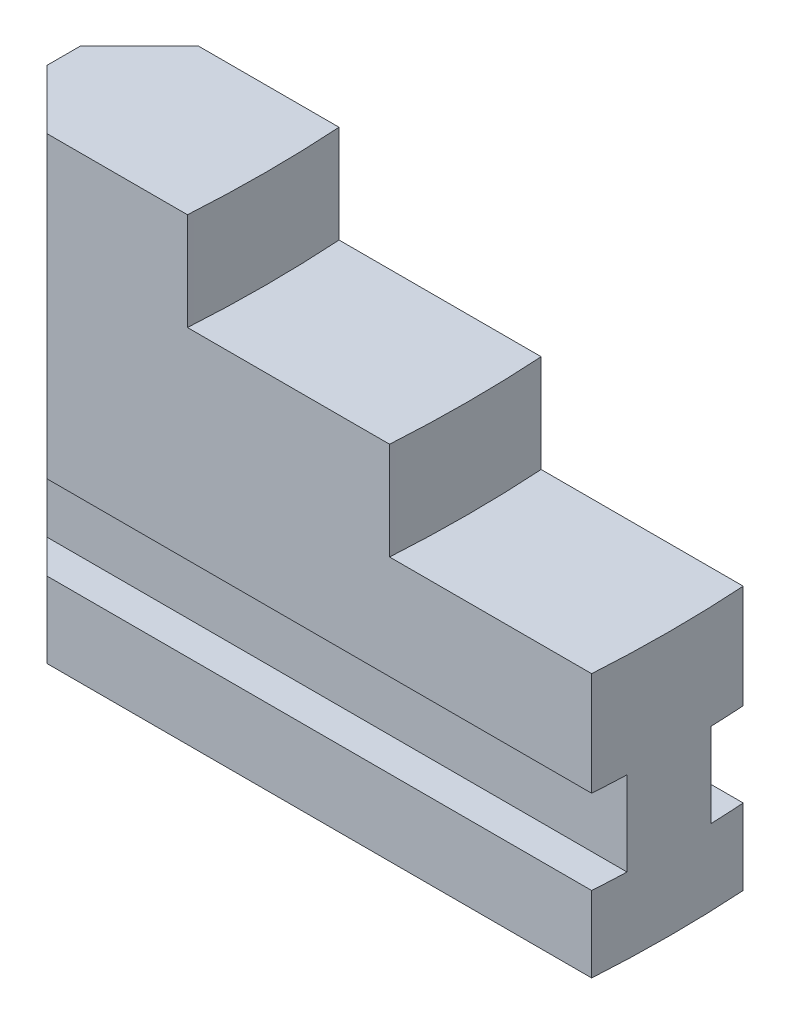
ISO-10303-21;
HEADER;
FILE_DESCRIPTION(('STEP AP214'),'2;1');
FILE_NAME('part.step','',(''),(''),'','','');
FILE_SCHEMA(('AUTOMOTIVE_DESIGN { 1 0 10303 214 1 1 1 1 }'));
ENDSEC;
DATA;
#1=APPLICATION_CONTEXT('core data for automotive mechanical design processes');
#2=APPLICATION_PROTOCOL_DEFINITION('international standard','automotive_design',2000,#1);
#3=PRODUCT_CONTEXT('',#1,'mechanical');
#4=PRODUCT('Part','Part','',(#3));
#5=PRODUCT_RELATED_PRODUCT_CATEGORY('part','',(#4));
#6=PRODUCT_DEFINITION_FORMATION('','',#4);
#7=PRODUCT_DEFINITION_CONTEXT('part definition',#1,'design');
#8=PRODUCT_DEFINITION('design','',#6,#7);
#9=PRODUCT_DEFINITION_SHAPE('','',#8);
#10=(LENGTH_UNIT() NAMED_UNIT(*) SI_UNIT(.MILLI.,.METRE.));
#11=(NAMED_UNIT(*) PLANE_ANGLE_UNIT() SI_UNIT($,.RADIAN.));
#12=(NAMED_UNIT(*) SI_UNIT($,.STERADIAN.) SOLID_ANGLE_UNIT());
#13=UNCERTAINTY_MEASURE_WITH_UNIT(LENGTH_MEASURE(1.E-05),#10,'distance_accuracy_value','');
#14=(GEOMETRIC_REPRESENTATION_CONTEXT(3) GLOBAL_UNCERTAINTY_ASSIGNED_CONTEXT((#13)) GLOBAL_UNIT_ASSIGNED_CONTEXT((#10,
#11,#12)) REPRESENTATION_CONTEXT('',''));
#15=CARTESIAN_POINT('',(0.,0.,0.));
#16=DIRECTION('',(0.,0.,1.));
#17=DIRECTION('',(1.,0.,0.));
#18=AXIS2_PLACEMENT_3D('',#15,#16,#17);
#19=CARTESIAN_POINT('',(0.,54.5,9.));
#20=DIRECTION('',(0.,-1.,0.));
#21=DIRECTION('',(0.,0.,-1.));
#22=AXIS2_PLACEMENT_3D('',#19,#20,#21);
#23=PLANE('',#22);
#24=DIRECTION('',(-1.,0.,0.));
#25=VECTOR('',#24,1.);
#26=CARTESIAN_POINT('',(0.,54.5,-9.));
#27=LINE('',#26,#25);
#28=CARTESIAN_POINT('',(23.7104147871589,54.5,-9.));
#29=VERTEX_POINT('',#28);
#30=CARTESIAN_POINT('',(7.00000000000002,54.5,-9.));
#31=VERTEX_POINT('',#30);
#32=EDGE_CURVE('E199',#29,#31,#27,.T.);
#33=ORIENTED_EDGE('',*,*,#32,.T.);
#34=DIRECTION('',(-0.707106781186549,0.,0.707106781186546));
#35=VECTOR('',#34,1.);
#36=CARTESIAN_POINT('',(0.,54.5,-2.00000000000001));
#37=LINE('',#36,#35);
#38=CARTESIAN_POINT('',(0.,54.5,-2.00000000000001));
#39=VERTEX_POINT('',#38);
#40=EDGE_CURVE('E247',#31,#39,#37,.T.);
#41=ORIENTED_EDGE('',*,*,#40,.T.);
#42=DIRECTION('',(0.,0.,-1.));
#43=VECTOR('',#42,1.);
#44=CARTESIAN_POINT('',(0.,54.5,9.));
#45=LINE('',#44,#43);
#46=CARTESIAN_POINT('',(0.,54.5,1.99999999999998));
#47=VERTEX_POINT('',#46);
#48=EDGE_CURVE('E216',#47,#39,#45,.T.);
#49=ORIENTED_EDGE('',*,*,#48,.F.);
#50=DIRECTION('',(-0.707106781186546,0.,-0.707106781186549));
#51=VECTOR('',#50,1.);
#52=CARTESIAN_POINT('',(6.99999999999999,54.5,9.));
#53=LINE('',#52,#51);
#54=CARTESIAN_POINT('',(6.99999999999999,54.5,9.));
#55=VERTEX_POINT('',#54);
#56=EDGE_CURVE('E245',#47,#55,#53,.F.);
#57=ORIENTED_EDGE('',*,*,#56,.T.);
#58=DIRECTION('',(-1.,0.,0.));
#59=VECTOR('',#58,1.);
#60=CARTESIAN_POINT('',(0.,54.5,9.));
#61=LINE('',#60,#59);
#62=CARTESIAN_POINT('',(23.7104147871589,54.5,9.00000000000004));
#63=VERTEX_POINT('',#62);
#64=EDGE_CURVE('E197',#63,#55,#61,.T.);
#65=ORIENTED_EDGE('',*,*,#64,.F.);
#66=CARTESIAN_POINT('',(-116.,54.5,0.));
#67=DIRECTION('',(0.,-1.,0.));
#68=DIRECTION('',(0.,0.,-1.));
#69=AXIS2_PLACEMENT_3D('',#66,#67,#68);
#70=CIRCLE('',#69,140.);
#71=EDGE_CURVE('E219',#63,#29,#70,.F.);
#72=ORIENTED_EDGE('',*,*,#71,.T.);
#73=EDGE_LOOP('',(#33,#41,#49,#57,#65,#72));
#74=FACE_BOUND('',#73,.T.);
#75=ADVANCED_FACE('F41',(#74),#23,.F.);
#76=CARTESIAN_POINT('',(0.,0.,9.));
#77=DIRECTION('',(0.,0.,-1.));
#78=DIRECTION('',(-1.,0.,0.));
#79=AXIS2_PLACEMENT_3D('',#76,#77,#78);
#80=PLANE('',#79);
#81=ORIENTED_EDGE('',*,*,#64,.T.);
#82=DIRECTION('',(0.,-1.,0.));
#83=VECTOR('',#82,1.);
#84=CARTESIAN_POINT('',(6.99999999999999,0.,9.));
#85=LINE('',#84,#83);
#86=CARTESIAN_POINT('',(6.99999999999999,19.,9.));
#87=VERTEX_POINT('',#86);
#88=EDGE_CURVE('E249',#55,#87,#85,.T.);
#89=ORIENTED_EDGE('',*,*,#88,.T.);
#90=DIRECTION('',(-1.,0.,0.));
#91=VECTOR('',#90,1.);
#92=CARTESIAN_POINT('',(72.,19.,9.));
#93=LINE('',#92,#91);
#94=CARTESIAN_POINT('',(71.7104147871589,19.,9.));
#95=VERTEX_POINT('',#94);
#96=EDGE_CURVE('E187',#95,#87,#93,.T.);
#97=ORIENTED_EDGE('',*,*,#96,.F.);
#98=DIRECTION('',(0.,1.,0.));
#99=VECTOR('',#98,1.);
#100=CARTESIAN_POINT('',(71.7104147871589,-18.1107702762748,9.));
#101=LINE('',#100,#99);
#102=CARTESIAN_POINT('',(71.7104147871589,31.3,9.));
#103=VERTEX_POINT('',#102);
#104=EDGE_CURVE('E170',#95,#103,#101,.T.);
#105=ORIENTED_EDGE('',*,*,#104,.T.);
#106=DIRECTION('',(-1.,0.,0.));
#107=VECTOR('',#106,1.);
#108=CARTESIAN_POINT('',(48.,31.3,9.));
#109=LINE('',#108,#107);
#110=CARTESIAN_POINT('',(47.7104147871589,31.3,9.00000000000001));
#111=VERTEX_POINT('',#110);
#112=EDGE_CURVE('E183',#103,#111,#109,.T.);
#113=ORIENTED_EDGE('',*,*,#112,.T.);
#114=DIRECTION('',(0.,1.,0.));
#115=VECTOR('',#114,1.);
#116=CARTESIAN_POINT('',(47.7104147871589,13.1892297237252,9.00000000000001));
#117=LINE('',#116,#115);
#118=CARTESIAN_POINT('',(47.7104147871589,42.9,9.00000000000001));
#119=VERTEX_POINT('',#118);
#120=EDGE_CURVE('E299',#111,#119,#117,.T.);
#121=ORIENTED_EDGE('',*,*,#120,.T.);
#122=DIRECTION('',(-1.,0.,0.));
#123=VECTOR('',#122,1.);
#124=CARTESIAN_POINT('',(24.,42.9,9.));
#125=LINE('',#124,#123);
#126=CARTESIAN_POINT('',(23.7104147871589,42.9,9.00000000000004));
#127=VERTEX_POINT('',#126);
#128=EDGE_CURVE('E194',#119,#127,#125,.T.);
#129=ORIENTED_EDGE('',*,*,#128,.T.);
#130=DIRECTION('',(0.,1.,0.));
#131=VECTOR('',#130,1.);
#132=CARTESIAN_POINT('',(23.7104147871589,24.789229723725,9.00000000000004));
#133=LINE('',#132,#131);
#134=EDGE_CURVE('E261',#127,#63,#133,.T.);
#135=ORIENTED_EDGE('',*,*,#134,.T.);
#136=EDGE_LOOP('',(#81,#89,#97,#105,#113,#121,#129,#135));
#137=FACE_BOUND('',#136,.T.);
#138=ADVANCED_FACE('F181',(#137),#80,.F.);
#139=CARTESIAN_POINT('',(0.,0.,-9.));
#140=DIRECTION('',(0.,0.,-1.));
#141=DIRECTION('',(-1.,0.,0.));
#142=AXIS2_PLACEMENT_3D('',#139,#140,#141);
#143=PLANE('',#142);
#144=DIRECTION('',(-1.,0.,0.));
#145=VECTOR('',#144,1.);
#146=CARTESIAN_POINT('',(72.,19.,-9.));
#147=LINE('',#146,#145);
#148=CARTESIAN_POINT('',(71.7104147871589,19.,-9.));
#149=VERTEX_POINT('',#148);
#150=CARTESIAN_POINT('',(7.00000000000002,19.,-9.));
#151=VERTEX_POINT('',#150);
#152=EDGE_CURVE('E208',#149,#151,#147,.T.);
#153=ORIENTED_EDGE('',*,*,#152,.T.);
#154=DIRECTION('',(0.,1.,0.));
#155=VECTOR('',#154,1.);
#156=CARTESIAN_POINT('',(7.00000000000002,54.5,-9.));
#157=LINE('',#156,#155);
#158=EDGE_CURVE('E243',#151,#31,#157,.T.);
#159=ORIENTED_EDGE('',*,*,#158,.T.);
#160=ORIENTED_EDGE('',*,*,#32,.F.);
#161=DIRECTION('',(0.,1.,0.));
#162=VECTOR('',#161,1.);
#163=CARTESIAN_POINT('',(23.7104147871589,24.789229723725,-9.));
#164=LINE('',#163,#162);
#165=CARTESIAN_POINT('',(23.7104147871589,42.9,-9.));
#166=VERTEX_POINT('',#165);
#167=EDGE_CURVE('E304',#166,#29,#164,.T.);
#168=ORIENTED_EDGE('',*,*,#167,.F.);
#169=DIRECTION('',(-1.,0.,0.));
#170=VECTOR('',#169,1.);
#171=CARTESIAN_POINT('',(24.,42.9,-9.));
#172=LINE('',#171,#170);
#173=CARTESIAN_POINT('',(47.7104147871589,42.9,-9.));
#174=VERTEX_POINT('',#173);
#175=EDGE_CURVE('E210',#174,#166,#172,.T.);
#176=ORIENTED_EDGE('',*,*,#175,.F.);
#177=DIRECTION('',(0.,1.,0.));
#178=VECTOR('',#177,1.);
#179=CARTESIAN_POINT('',(47.7104147871589,13.1892297237252,-8.99999999999999));
#180=LINE('',#179,#178);
#181=CARTESIAN_POINT('',(47.7104147871589,31.3,-8.99999999999999));
#182=VERTEX_POINT('',#181);
#183=EDGE_CURVE('E301',#182,#174,#180,.T.);
#184=ORIENTED_EDGE('',*,*,#183,.F.);
#185=DIRECTION('',(-1.,0.,0.));
#186=VECTOR('',#185,1.);
#187=CARTESIAN_POINT('',(48.,31.3,-9.));
#188=LINE('',#187,#186);
#189=CARTESIAN_POINT('',(71.7104147871589,31.3,-9.));
#190=VERTEX_POINT('',#189);
#191=EDGE_CURVE('E207',#190,#182,#188,.T.);
#192=ORIENTED_EDGE('',*,*,#191,.F.);
#193=DIRECTION('',(0.,1.,0.));
#194=VECTOR('',#193,1.);
#195=CARTESIAN_POINT('',(71.7104147871589,-18.1107702762748,-9.));
#196=LINE('',#195,#194);
#197=EDGE_CURVE('E173',#149,#190,#196,.T.);
#198=ORIENTED_EDGE('',*,*,#197,.F.);
#199=EDGE_LOOP('',(#153,#159,#160,#168,#176,#184,#192,#198));
#200=FACE_BOUND('',#199,.T.);
#201=ADVANCED_FACE('F344',(#200),#143,.T.);
#202=CARTESIAN_POINT('',(72.,0.,9.));
#203=DIRECTION('',(0.,1.,0.));
#204=DIRECTION('',(-1.,0.,0.));
#205=AXIS2_PLACEMENT_3D('',#202,#203,#204);
#206=PLANE('',#205);
#207=DIRECTION('',(0.,0.,-1.));
#208=VECTOR('',#207,1.);
#209=CARTESIAN_POINT('',(0.,0.,9.));
#210=LINE('',#209,#208);
#211=CARTESIAN_POINT('',(0.,0.,1.99999999999998));
#212=VERTEX_POINT('',#211);
#213=CARTESIAN_POINT('',(0.,0.,-2.00000000000001));
#214=VERTEX_POINT('',#213);
#215=EDGE_CURVE('E204',#212,#214,#210,.T.);
#216=ORIENTED_EDGE('',*,*,#215,.T.);
#217=DIRECTION('',(0.707106781186549,0.,-0.707106781186546));
#218=VECTOR('',#217,1.);
#219=CARTESIAN_POINT('',(0.,0.,-2.00000000000001));
#220=LINE('',#219,#218);
#221=CARTESIAN_POINT('',(7.00000000000002,0.,-9.));
#222=VERTEX_POINT('',#221);
#223=EDGE_CURVE('E233',#214,#222,#220,.T.);
#224=ORIENTED_EDGE('',*,*,#223,.T.);
#225=DIRECTION('',(1.,0.,0.));
#226=VECTOR('',#225,1.);
#227=CARTESIAN_POINT('',(72.,0.,-9.));
#228=LINE('',#227,#226);
#229=CARTESIAN_POINT('',(71.7104147871589,0.,-9.));
#230=VERTEX_POINT('',#229);
#231=EDGE_CURVE('E205',#222,#230,#228,.T.);
#232=ORIENTED_EDGE('',*,*,#231,.T.);
#233=CARTESIAN_POINT('',(-68.,0.,0.));
#234=DIRECTION('',(0.,1.,0.));
#235=DIRECTION('',(-1.,0.,0.));
#236=AXIS2_PLACEMENT_3D('',#233,#234,#235);
#237=CIRCLE('',#236,140.);
#238=CARTESIAN_POINT('',(71.7104147871589,0.,9.));
#239=VERTEX_POINT('',#238);
#240=EDGE_CURVE('E277',#239,#230,#237,.T.);
#241=ORIENTED_EDGE('',*,*,#240,.F.);
#242=DIRECTION('',(1.,0.,0.));
#243=VECTOR('',#242,1.);
#244=CARTESIAN_POINT('',(72.,0.,9.));
#245=LINE('',#244,#243);
#246=CARTESIAN_POINT('',(6.99999999999999,0.,9.));
#247=VERTEX_POINT('',#246);
#248=EDGE_CURVE('E195',#247,#239,#245,.T.);
#249=ORIENTED_EDGE('',*,*,#248,.F.);
#250=DIRECTION('',(0.707106781186546,0.,0.707106781186549));
#251=VECTOR('',#250,1.);
#252=CARTESIAN_POINT('',(6.99999999999999,0.,9.));
#253=LINE('',#252,#251);
#254=EDGE_CURVE('E231',#247,#212,#253,.F.);
#255=ORIENTED_EDGE('',*,*,#254,.T.);
#256=EDGE_LOOP('',(#216,#224,#232,#241,#249,#255));
#257=FACE_BOUND('',#256,.T.);
#258=ADVANCED_FACE('F274',(#257),#206,.F.);
#259=CARTESIAN_POINT('',(48.,31.3,9.));
#260=DIRECTION('',(0.,-1.,0.));
#261=DIRECTION('',(0.,0.,-1.));
#262=AXIS2_PLACEMENT_3D('',#259,#260,#261);
#263=PLANE('',#262);
#264=ORIENTED_EDGE('',*,*,#112,.F.);
#265=CARTESIAN_POINT('',(-68.,31.3,0.));
#266=DIRECTION('',(0.,-1.,0.));
#267=DIRECTION('',(0.,0.,-1.));
#268=AXIS2_PLACEMENT_3D('',#265,#266,#267);
#269=CIRCLE('',#268,140.);
#270=EDGE_CURVE('E167',#190,#103,#269,.T.);
#271=ORIENTED_EDGE('',*,*,#270,.F.);
#272=ORIENTED_EDGE('',*,*,#191,.T.);
#273=CARTESIAN_POINT('',(-92.,31.3,0.));
#274=DIRECTION('',(0.,-1.,0.));
#275=DIRECTION('',(0.,0.,-1.));
#276=AXIS2_PLACEMENT_3D('',#273,#274,#275);
#277=CIRCLE('',#276,140.);
#278=EDGE_CURVE('E192',#182,#111,#277,.T.);
#279=ORIENTED_EDGE('',*,*,#278,.T.);
#280=EDGE_LOOP('',(#264,#271,#272,#279));
#281=FACE_BOUND('',#280,.T.);
#282=ADVANCED_FACE('F190',(#281),#263,.F.);
#283=CARTESIAN_POINT('',(24.,42.9,9.));
#284=DIRECTION('',(0.,-1.,0.));
#285=DIRECTION('',(0.,0.,-1.));
#286=AXIS2_PLACEMENT_3D('',#283,#284,#285);
#287=PLANE('',#286);
#288=ORIENTED_EDGE('',*,*,#128,.F.);
#289=CARTESIAN_POINT('',(-92.,42.9,0.));
#290=DIRECTION('',(0.,-1.,0.));
#291=DIRECTION('',(0.,0.,-1.));
#292=AXIS2_PLACEMENT_3D('',#289,#290,#291);
#293=CIRCLE('',#292,140.);
#294=EDGE_CURVE('E221',#119,#174,#293,.F.);
#295=ORIENTED_EDGE('',*,*,#294,.T.);
#296=ORIENTED_EDGE('',*,*,#175,.T.);
#297=CARTESIAN_POINT('',(-116.,42.9,0.));
#298=DIRECTION('',(0.,-1.,0.));
#299=DIRECTION('',(0.,0.,-1.));
#300=AXIS2_PLACEMENT_3D('',#297,#298,#299);
#301=CIRCLE('',#300,140.);
#302=EDGE_CURVE('E305',#166,#127,#301,.T.);
#303=ORIENTED_EDGE('',*,*,#302,.T.);
#304=EDGE_LOOP('',(#288,#295,#296,#303));
#305=FACE_BOUND('',#304,.T.);
#306=ADVANCED_FACE('F350',(#305),#287,.F.);
#307=CARTESIAN_POINT('',(0.,0.,9.));
#308=DIRECTION('',(1.,0.,0.));
#309=DIRECTION('',(0.,0.,-1.));
#310=AXIS2_PLACEMENT_3D('',#307,#308,#309);
#311=PLANE('',#310);
#312=ORIENTED_EDGE('',*,*,#48,.T.);
#313=DIRECTION('',(0.,-1.,0.));
#314=VECTOR('',#313,1.);
#315=CARTESIAN_POINT('',(0.,19.,-2.00000000000001));
#316=LINE('',#315,#314);
#317=EDGE_CURVE('E228',#39,#214,#316,.T.);
#318=ORIENTED_EDGE('',*,*,#317,.T.);
#319=ORIENTED_EDGE('',*,*,#215,.F.);
#320=DIRECTION('',(0.,1.,0.));
#321=VECTOR('',#320,1.);
#322=CARTESIAN_POINT('',(0.,0.,1.99999999999998));
#323=LINE('',#322,#321);
#324=EDGE_CURVE('E226',#212,#47,#323,.T.);
#325=ORIENTED_EDGE('',*,*,#324,.T.);
#326=EDGE_LOOP('',(#312,#318,#319,#325));
#327=FACE_BOUND('',#326,.T.);
#328=ADVANCED_FACE('F348',(#327),#311,.F.);
#329=DIRECTION('',(-1.,0.,0.));
#330=VECTOR('',#329,1.);
#331=CARTESIAN_POINT('',(72.,9.,9.));
#332=LINE('',#331,#330);
#333=CARTESIAN_POINT('',(71.7104147871589,9.,9.));
#334=VERTEX_POINT('',#333);
#335=CARTESIAN_POINT('',(6.99999999999999,9.,9.));
#336=VERTEX_POINT('',#335);
#337=EDGE_CURVE('E271',#334,#336,#332,.T.);
#338=ORIENTED_EDGE('',*,*,#337,.T.);
#339=DIRECTION('',(0.,1.,0.));
#340=VECTOR('',#339,1.);
#341=CARTESIAN_POINT('',(6.99999999999999,0.,9.));
#342=LINE('',#341,#340);
#343=EDGE_CURVE('E11',#336,#247,#342,.F.);
#344=ORIENTED_EDGE('',*,*,#343,.T.);
#345=ORIENTED_EDGE('',*,*,#248,.T.);
#346=EDGE_CURVE('E188',#239,#334,#101,.T.);
#347=ORIENTED_EDGE('',*,*,#346,.T.);
#348=EDGE_LOOP('',(#338,#344,#345,#347));
#349=FACE_BOUND('',#348,.T.);
#350=ADVANCED_FACE('F268',(#349),#80,.F.);
#351=ORIENTED_EDGE('',*,*,#231,.F.);
#352=DIRECTION('',(0.,1.,0.));
#353=VECTOR('',#352,1.);
#354=CARTESIAN_POINT('',(7.00000000000002,0.,-9.));
#355=LINE('',#354,#353);
#356=CARTESIAN_POINT('',(7.00000000000002,9.,-9.));
#357=VERTEX_POINT('',#356);
#358=EDGE_CURVE('E235',#222,#357,#355,.T.);
#359=ORIENTED_EDGE('',*,*,#358,.T.);
#360=DIRECTION('',(-1.,0.,0.));
#361=VECTOR('',#360,1.);
#362=CARTESIAN_POINT('',(72.,9.,-9.));
#363=LINE('',#362,#361);
#364=CARTESIAN_POINT('',(71.7104147871589,9.,-9.));
#365=VERTEX_POINT('',#364);
#366=EDGE_CURVE('E320',#365,#357,#363,.T.);
#367=ORIENTED_EDGE('',*,*,#366,.F.);
#368=EDGE_CURVE('E281',#230,#365,#196,.T.);
#369=ORIENTED_EDGE('',*,*,#368,.F.);
#370=EDGE_LOOP('',(#351,#359,#367,#369));
#371=FACE_BOUND('',#370,.T.);
#372=ADVANCED_FACE('F396',(#371),#143,.T.);
#373=CARTESIAN_POINT('',(72.,19.,-9.));
#374=DIRECTION('',(0.,1.,0.));
#375=DIRECTION('',(0.,0.,1.));
#376=AXIS2_PLACEMENT_3D('',#373,#374,#375);
#377=PLANE('',#376);
#378=DIRECTION('',(-1.,0.,0.));
#379=VECTOR('',#378,1.);
#380=CARTESIAN_POINT('',(72.,19.,-5.));
#381=LINE('',#380,#379);
#382=CARTESIAN_POINT('',(71.9106857963322,19.,-5.));
#383=VERTEX_POINT('',#382);
#384=CARTESIAN_POINT('',(3.,19.,-5.));
#385=VERTEX_POINT('',#384);
#386=EDGE_CURVE('E314',#383,#385,#381,.T.);
#387=ORIENTED_EDGE('',*,*,#386,.T.);
#388=DIRECTION('',(0.707106781186549,0.,-0.707106781186546));
#389=VECTOR('',#388,1.);
#390=CARTESIAN_POINT('',(0.,19.,-2.00000000000001));
#391=LINE('',#390,#389);
#392=EDGE_CURVE('E241',#385,#151,#391,.T.);
#393=ORIENTED_EDGE('',*,*,#392,.T.);
#394=ORIENTED_EDGE('',*,*,#152,.F.);
#395=CARTESIAN_POINT('',(-68.,19.,0.));
#396=DIRECTION('',(0.,1.,0.));
#397=DIRECTION('',(0.,0.,1.));
#398=AXIS2_PLACEMENT_3D('',#395,#396,#397);
#399=CIRCLE('',#398,140.);
#400=EDGE_CURVE('E295',#149,#383,#399,.F.);
#401=ORIENTED_EDGE('',*,*,#400,.T.);
#402=EDGE_LOOP('',(#387,#393,#394,#401));
#403=FACE_BOUND('',#402,.T.);
#404=ADVANCED_FACE('F385',(#403),#377,.F.);
#405=CARTESIAN_POINT('',(72.,19.,-5.));
#406=DIRECTION('',(0.,0.,1.));
#407=DIRECTION('',(0.,-1.,0.));
#408=AXIS2_PLACEMENT_3D('',#405,#406,#407);
#409=PLANE('',#408);
#410=DIRECTION('',(-1.,0.,0.));
#411=VECTOR('',#410,1.);
#412=CARTESIAN_POINT('',(72.,9.,-5.));
#413=LINE('',#412,#411);
#414=CARTESIAN_POINT('',(71.9106857963322,9.,-5.));
#415=VERTEX_POINT('',#414);
#416=CARTESIAN_POINT('',(3.,9.,-5.));
#417=VERTEX_POINT('',#416);
#418=EDGE_CURVE('E317',#415,#417,#413,.T.);
#419=ORIENTED_EDGE('',*,*,#418,.T.);
#420=DIRECTION('',(0.,1.,0.));
#421=VECTOR('',#420,1.);
#422=CARTESIAN_POINT('',(3.,0.,-5.));
#423=LINE('',#422,#421);
#424=EDGE_CURVE('E239',#417,#385,#423,.T.);
#425=ORIENTED_EDGE('',*,*,#424,.T.);
#426=ORIENTED_EDGE('',*,*,#386,.F.);
#427=DIRECTION('',(0.,1.,0.));
#428=VECTOR('',#427,1.);
#429=CARTESIAN_POINT('',(71.9106857963322,-18.1107702762748,-5.));
#430=LINE('',#429,#428);
#431=EDGE_CURVE('E292',#383,#415,#430,.F.);
#432=ORIENTED_EDGE('',*,*,#431,.T.);
#433=EDGE_LOOP('',(#419,#425,#426,#432));
#434=FACE_BOUND('',#433,.T.);
#435=ADVANCED_FACE('F391',(#434),#409,.F.);
#436=CARTESIAN_POINT('',(72.,9.,-9.));
#437=DIRECTION('',(0.,-1.,0.));
#438=DIRECTION('',(0.,0.,-1.));
#439=AXIS2_PLACEMENT_3D('',#436,#437,#438);
#440=PLANE('',#439);
#441=ORIENTED_EDGE('',*,*,#366,.T.);
#442=DIRECTION('',(-0.707106781186549,0.,0.707106781186546));
#443=VECTOR('',#442,1.);
#444=CARTESIAN_POINT('',(0.,9.,-2.00000000000001));
#445=LINE('',#444,#443);
#446=EDGE_CURVE('E237',#357,#417,#445,.T.);
#447=ORIENTED_EDGE('',*,*,#446,.T.);
#448=ORIENTED_EDGE('',*,*,#418,.F.);
#449=CARTESIAN_POINT('',(-68.,9.,0.));
#450=DIRECTION('',(0.,-1.,0.));
#451=DIRECTION('',(0.,0.,-1.));
#452=AXIS2_PLACEMENT_3D('',#449,#450,#451);
#453=CIRCLE('',#452,140.);
#454=EDGE_CURVE('E289',#415,#365,#453,.F.);
#455=ORIENTED_EDGE('',*,*,#454,.T.);
#456=EDGE_LOOP('',(#441,#447,#448,#455));
#457=FACE_BOUND('',#456,.T.);
#458=ADVANCED_FACE('F334',(#457),#440,.F.);
#459=CARTESIAN_POINT('',(72.,19.,9.));
#460=DIRECTION('',(0.,1.,0.));
#461=DIRECTION('',(0.,0.,1.));
#462=AXIS2_PLACEMENT_3D('',#459,#460,#461);
#463=PLANE('',#462);
#464=ORIENTED_EDGE('',*,*,#96,.T.);
#465=DIRECTION('',(0.707106781186546,0.,0.707106781186549));
#466=VECTOR('',#465,1.);
#467=CARTESIAN_POINT('',(6.99999999999999,19.,9.));
#468=LINE('',#467,#466);
#469=CARTESIAN_POINT('',(3.00000000000002,19.,5.));
#470=VERTEX_POINT('',#469);
#471=EDGE_CURVE('E251',#87,#470,#468,.F.);
#472=ORIENTED_EDGE('',*,*,#471,.T.);
#473=DIRECTION('',(-1.,0.,0.));
#474=VECTOR('',#473,1.);
#475=CARTESIAN_POINT('',(72.,19.,5.));
#476=LINE('',#475,#474);
#477=CARTESIAN_POINT('',(71.9106857963322,19.,5.));
#478=VERTEX_POINT('',#477);
#479=EDGE_CURVE('E256',#478,#470,#476,.T.);
#480=ORIENTED_EDGE('',*,*,#479,.F.);
#481=CARTESIAN_POINT('',(-68.,19.,0.));
#482=DIRECTION('',(0.,1.,0.));
#483=DIRECTION('',(0.,0.,1.));
#484=AXIS2_PLACEMENT_3D('',#481,#482,#483);
#485=CIRCLE('',#484,140.);
#486=EDGE_CURVE('E284',#478,#95,#485,.F.);
#487=ORIENTED_EDGE('',*,*,#486,.T.);
#488=EDGE_LOOP('',(#464,#472,#480,#487));
#489=FACE_BOUND('',#488,.T.);
#490=ADVANCED_FACE('F255',(#489),#463,.F.);
#491=CARTESIAN_POINT('',(72.,9.,9.));
#492=DIRECTION('',(0.,-1.,0.));
#493=DIRECTION('',(0.,0.,-1.));
#494=AXIS2_PLACEMENT_3D('',#491,#492,#493);
#495=PLANE('',#494);
#496=DIRECTION('',(-1.,0.,0.));
#497=VECTOR('',#496,1.);
#498=CARTESIAN_POINT('',(72.,9.,5.));
#499=LINE('',#498,#497);
#500=CARTESIAN_POINT('',(71.9106857963322,9.,5.));
#501=VERTEX_POINT('',#500);
#502=CARTESIAN_POINT('',(3.,9.,5.));
#503=VERTEX_POINT('',#502);
#504=EDGE_CURVE('E260',#501,#503,#499,.T.);
#505=ORIENTED_EDGE('',*,*,#504,.T.);
#506=DIRECTION('',(-0.707106781186546,0.,-0.707106781186549));
#507=VECTOR('',#506,1.);
#508=CARTESIAN_POINT('',(6.99999999999999,9.,9.));
#509=LINE('',#508,#507);
#510=EDGE_CURVE('E50',#503,#336,#509,.F.);
#511=ORIENTED_EDGE('',*,*,#510,.T.);
#512=ORIENTED_EDGE('',*,*,#337,.F.);
#513=CARTESIAN_POINT('',(-68.,9.,0.));
#514=DIRECTION('',(0.,-1.,0.));
#515=DIRECTION('',(0.,0.,-1.));
#516=AXIS2_PLACEMENT_3D('',#513,#514,#515);
#517=CIRCLE('',#516,140.);
#518=EDGE_CURVE('E280',#334,#501,#517,.F.);
#519=ORIENTED_EDGE('',*,*,#518,.T.);
#520=EDGE_LOOP('',(#505,#511,#512,#519));
#521=FACE_BOUND('',#520,.T.);
#522=ADVANCED_FACE('F325',(#521),#495,.F.);
#523=CARTESIAN_POINT('',(72.,19.,5.));
#524=DIRECTION('',(0.,0.,-1.));
#525=DIRECTION('',(0.,1.,0.));
#526=AXIS2_PLACEMENT_3D('',#523,#524,#525);
#527=PLANE('',#526);
#528=ORIENTED_EDGE('',*,*,#479,.T.);
#529=DIRECTION('',(0.,1.,0.));
#530=VECTOR('',#529,1.);
#531=CARTESIAN_POINT('',(3.00000000000001,0.,5.));
#532=LINE('',#531,#530);
#533=EDGE_CURVE('E64',#470,#503,#532,.F.);
#534=ORIENTED_EDGE('',*,*,#533,.T.);
#535=ORIENTED_EDGE('',*,*,#504,.F.);
#536=DIRECTION('',(0.,1.,0.));
#537=VECTOR('',#536,1.);
#538=CARTESIAN_POINT('',(71.9106857963322,-18.1107702762748,5.));
#539=LINE('',#538,#537);
#540=EDGE_CURVE('E223',#501,#478,#539,.T.);
#541=ORIENTED_EDGE('',*,*,#540,.T.);
#542=EDGE_LOOP('',(#528,#534,#535,#541));
#543=FACE_BOUND('',#542,.T.);
#544=ADVANCED_FACE('F259',(#543),#527,.F.);
#545=CARTESIAN_POINT('',(-116.,24.789229723725,0.));
#546=DIRECTION('',(0.,1.,0.));
#547=DIRECTION('',(0.,0.,1.));
#548=AXIS2_PLACEMENT_3D('',#545,#546,#547);
#549=CYLINDRICAL_SURFACE('',#548,140.);
#550=ORIENTED_EDGE('',*,*,#71,.F.);
#551=ORIENTED_EDGE('',*,*,#134,.F.);
#552=ORIENTED_EDGE('',*,*,#302,.F.);
#553=ORIENTED_EDGE('',*,*,#167,.T.);
#554=EDGE_LOOP('',(#550,#551,#552,#553));
#555=FACE_BOUND('',#554,.T.);
#556=ADVANCED_FACE('F332',(#555),#549,.T.);
#557=CARTESIAN_POINT('',(-92.,13.1892297237252,0.));
#558=DIRECTION('',(0.,1.,0.));
#559=DIRECTION('',(0.,0.,1.));
#560=AXIS2_PLACEMENT_3D('',#557,#558,#559);
#561=CYLINDRICAL_SURFACE('',#560,140.);
#562=ORIENTED_EDGE('',*,*,#294,.F.);
#563=ORIENTED_EDGE('',*,*,#120,.F.);
#564=ORIENTED_EDGE('',*,*,#278,.F.);
#565=ORIENTED_EDGE('',*,*,#183,.T.);
#566=EDGE_LOOP('',(#562,#563,#564,#565));
#567=FACE_BOUND('',#566,.T.);
#568=ADVANCED_FACE('F366',(#567),#561,.T.);
#569=CARTESIAN_POINT('',(-68.,-18.1107702762748,0.));
#570=DIRECTION('',(0.,1.,0.));
#571=DIRECTION('',(0.,0.,1.));
#572=AXIS2_PLACEMENT_3D('',#569,#570,#571);
#573=CYLINDRICAL_SURFACE('',#572,140.);
#574=ORIENTED_EDGE('',*,*,#270,.T.);
#575=ORIENTED_EDGE('',*,*,#104,.F.);
#576=ORIENTED_EDGE('',*,*,#486,.F.);
#577=ORIENTED_EDGE('',*,*,#540,.F.);
#578=ORIENTED_EDGE('',*,*,#518,.F.);
#579=ORIENTED_EDGE('',*,*,#346,.F.);
#580=ORIENTED_EDGE('',*,*,#240,.T.);
#581=ORIENTED_EDGE('',*,*,#368,.T.);
#582=ORIENTED_EDGE('',*,*,#454,.F.);
#583=ORIENTED_EDGE('',*,*,#431,.F.);
#584=ORIENTED_EDGE('',*,*,#400,.F.);
#585=ORIENTED_EDGE('',*,*,#197,.T.);
#586=EDGE_LOOP('',(#574,#575,#576,#577,#578,#579,#580,#581,#582,#583,#584,#585));
#587=FACE_BOUND('',#586,.T.);
#588=ADVANCED_FACE('F169',(#587),#573,.T.);
#589=CARTESIAN_POINT('',(0.,0.,-2.00000000000001));
#590=DIRECTION('',(-0.707106781186546,0.,-0.707106781186549));
#591=DIRECTION('',(0.,1.,0.));
#592=AXIS2_PLACEMENT_3D('',#589,#590,#591);
#593=PLANE('',#592);
#594=ORIENTED_EDGE('',*,*,#40,.F.);
#595=ORIENTED_EDGE('',*,*,#158,.F.);
#596=ORIENTED_EDGE('',*,*,#392,.F.);
#597=ORIENTED_EDGE('',*,*,#424,.F.);
#598=ORIENTED_EDGE('',*,*,#446,.F.);
#599=ORIENTED_EDGE('',*,*,#358,.F.);
#600=ORIENTED_EDGE('',*,*,#223,.F.);
#601=ORIENTED_EDGE('',*,*,#317,.F.);
#602=EDGE_LOOP('',(#594,#595,#596,#597,#598,#599,#600,#601));
#603=FACE_BOUND('',#602,.T.);
#604=ADVANCED_FACE('F358',(#603),#593,.T.);
#605=CARTESIAN_POINT('',(6.99999999999999,0.,9.));
#606=DIRECTION('',(0.707106781186549,0.,-0.707106781186546));
#607=DIRECTION('',(0.,-1.,0.));
#608=AXIS2_PLACEMENT_3D('',#605,#606,#607);
#609=PLANE('',#608);
#610=ORIENTED_EDGE('',*,*,#56,.F.);
#611=ORIENTED_EDGE('',*,*,#324,.F.);
#612=ORIENTED_EDGE('',*,*,#254,.F.);
#613=ORIENTED_EDGE('',*,*,#343,.F.);
#614=ORIENTED_EDGE('',*,*,#510,.F.);
#615=ORIENTED_EDGE('',*,*,#533,.F.);
#616=ORIENTED_EDGE('',*,*,#471,.F.);
#617=ORIENTED_EDGE('',*,*,#88,.F.);
#618=EDGE_LOOP('',(#610,#611,#612,#613,#614,#615,#616,#617));
#619=FACE_BOUND('',#618,.T.);
#620=ADVANCED_FACE('F44',(#619),#609,.F.);
#621=CLOSED_SHELL('',(#75,#138,#201,#258,#282,#306,#328,#350,#372,#404,#435,#458,#490,#522,#544,
#556,#568,#588,#604,#620));
#622=MANIFOLD_SOLID_BREP('B2',#621);
#623=ADVANCED_BREP_SHAPE_REPRESENTATION('',(#18,#622),#14);
#624=SHAPE_DEFINITION_REPRESENTATION(#9,#623);
ENDSEC;
END-ISO-10303-21;
